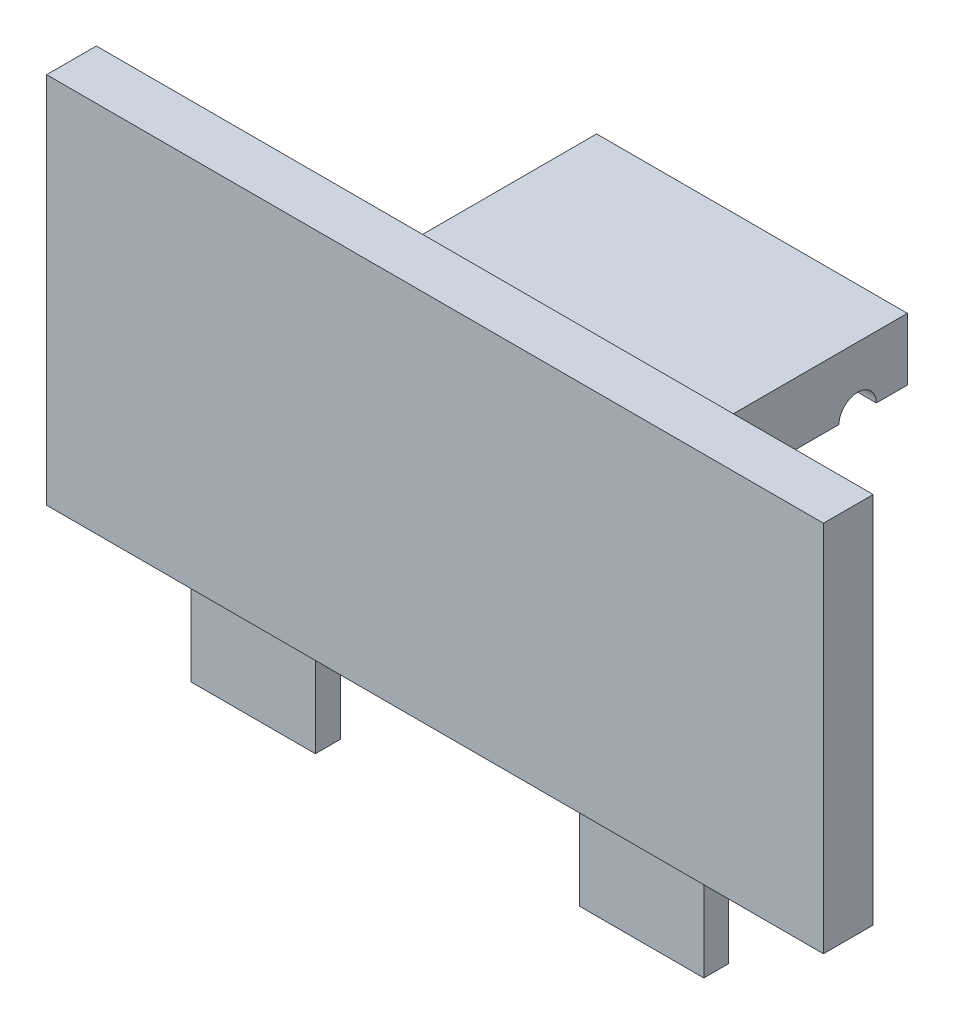
ISO-10303-21;
HEADER;
FILE_DESCRIPTION(('STEP AP214'),'2;1');
FILE_NAME('part.step','',(''),(''),'','','');
FILE_SCHEMA(('AUTOMOTIVE_DESIGN { 1 0 10303 214 1 1 1 1 }'));
ENDSEC;
DATA;
#1=APPLICATION_CONTEXT('core data for automotive mechanical design processes');
#2=APPLICATION_PROTOCOL_DEFINITION('international standard','automotive_design',2000,#1);
#3=PRODUCT_CONTEXT('',#1,'mechanical');
#4=PRODUCT('Part','Part','',(#3));
#5=PRODUCT_RELATED_PRODUCT_CATEGORY('part','',(#4));
#6=PRODUCT_DEFINITION_FORMATION('','',#4);
#7=PRODUCT_DEFINITION_CONTEXT('part definition',#1,'design');
#8=PRODUCT_DEFINITION('design','',#6,#7);
#9=PRODUCT_DEFINITION_SHAPE('','',#8);
#10=(LENGTH_UNIT() NAMED_UNIT(*) SI_UNIT(.MILLI.,.METRE.));
#11=(NAMED_UNIT(*) PLANE_ANGLE_UNIT() SI_UNIT($,.RADIAN.));
#12=(NAMED_UNIT(*) SI_UNIT($,.STERADIAN.) SOLID_ANGLE_UNIT());
#13=UNCERTAINTY_MEASURE_WITH_UNIT(LENGTH_MEASURE(1.E-05),#10,'distance_accuracy_value','');
#14=(GEOMETRIC_REPRESENTATION_CONTEXT(3) GLOBAL_UNCERTAINTY_ASSIGNED_CONTEXT((#13)) GLOBAL_UNIT_ASSIGNED_CONTEXT((#10,
#11,#12)) REPRESENTATION_CONTEXT('',''));
#15=CARTESIAN_POINT('',(0.,0.,0.));
#16=DIRECTION('',(0.,0.,1.));
#17=DIRECTION('',(1.,0.,0.));
#18=AXIS2_PLACEMENT_3D('',#15,#16,#17);
#19=CARTESIAN_POINT('',(87.5,35.,-51.));
#20=DIRECTION('',(0.,1.,0.));
#21=DIRECTION('',(0.,0.,1.));
#22=AXIS2_PLACEMENT_3D('',#19,#20,#21);
#23=PLANE('',#22);
#24=DIRECTION('',(0.,0.,1.));
#25=VECTOR('',#24,1.);
#26=CARTESIAN_POINT('',(87.5,35.,-51.));
#27=LINE('',#26,#25);
#28=CARTESIAN_POINT('',(87.5,35.,-51.));
#29=VERTEX_POINT('',#28);
#30=CARTESIAN_POINT('',(87.5,35.,-46.));
#31=VERTEX_POINT('',#30);
#32=EDGE_CURVE('E172',#29,#31,#27,.T.);
#33=ORIENTED_EDGE('',*,*,#32,.T.);
#34=DIRECTION('',(-1.,0.,0.));
#35=VECTOR('',#34,1.);
#36=CARTESIAN_POINT('',(37.5,35.,-46.));
#37=LINE('',#36,#35);
#38=CARTESIAN_POINT('',(37.5,35.,-46.));
#39=VERTEX_POINT('',#38);
#40=EDGE_CURVE('E11',#31,#39,#37,.T.);
#41=ORIENTED_EDGE('',*,*,#40,.T.);
#42=DIRECTION('',(0.,0.,1.));
#43=VECTOR('',#42,1.);
#44=CARTESIAN_POINT('',(37.5,35.,-51.));
#45=LINE('',#44,#43);
#46=CARTESIAN_POINT('',(37.5,35.,-51.));
#47=VERTEX_POINT('',#46);
#48=EDGE_CURVE('E184',#47,#39,#45,.T.);
#49=ORIENTED_EDGE('',*,*,#48,.F.);
#50=DIRECTION('',(-1.,0.,0.));
#51=VECTOR('',#50,1.);
#52=CARTESIAN_POINT('',(87.5,35.,-51.));
#53=LINE('',#52,#51);
#54=EDGE_CURVE('E178',#29,#47,#53,.T.);
#55=ORIENTED_EDGE('',*,*,#54,.F.);
#56=EDGE_LOOP('',(#33,#41,#49,#55));
#57=FACE_BOUND('',#56,.T.);
#58=ADVANCED_FACE('F37',(#57),#23,.F.);
#59=CARTESIAN_POINT('',(0.,0.,0.));
#60=DIRECTION('',(0.,-1.,0.));
#61=DIRECTION('',(0.,0.,-1.));
#62=AXIS2_PLACEMENT_3D('',#59,#60,#61);
#63=PLANE('',#62);
#64=DIRECTION('',(0.,0.,1.));
#65=VECTOR('',#64,1.);
#66=CARTESIAN_POINT('',(0.,0.,0.));
#67=LINE('',#66,#65);
#68=CARTESIAN_POINT('',(0.,0.,-8.));
#69=VERTEX_POINT('',#68);
#70=CARTESIAN_POINT('',(0.,0.,0.));
#71=VERTEX_POINT('',#70);
#72=EDGE_CURVE('E190',#69,#71,#67,.T.);
#73=ORIENTED_EDGE('',*,*,#72,.F.);
#74=DIRECTION('',(-1.,0.,0.));
#75=VECTOR('',#74,1.);
#76=CARTESIAN_POINT('',(0.,0.,-8.));
#77=LINE('',#76,#75);
#78=CARTESIAN_POINT('',(125.,0.,-8.));
#79=VERTEX_POINT('',#78);
#80=EDGE_CURVE('E195',#79,#69,#77,.T.);
#81=ORIENTED_EDGE('',*,*,#80,.F.);
#82=DIRECTION('',(0.,0.,-1.));
#83=VECTOR('',#82,1.);
#84=CARTESIAN_POINT('',(125.,0.,0.));
#85=LINE('',#84,#83);
#86=CARTESIAN_POINT('',(125.,0.,0.));
#87=VERTEX_POINT('',#86);
#88=EDGE_CURVE('E206',#87,#79,#85,.T.);
#89=ORIENTED_EDGE('',*,*,#88,.F.);
#90=DIRECTION('',(1.,0.,0.));
#91=VECTOR('',#90,1.);
#92=CARTESIAN_POINT('',(0.,0.,0.));
#93=LINE('',#92,#91);
#94=EDGE_CURVE('E204',#71,#87,#93,.T.);
#95=ORIENTED_EDGE('',*,*,#94,.F.);
#96=EDGE_LOOP('',(#73,#81,#89,#95));
#97=FACE_BOUND('',#96,.T.);
#98=DIRECTION('',(-1.,0.,0.));
#99=VECTOR('',#98,1.);
#100=CARTESIAN_POINT('',(21.25,0.,-2.));
#101=LINE('',#100,#99);
#102=CARTESIAN_POINT('',(41.25,0.,-2.));
#103=VERTEX_POINT('',#102);
#104=CARTESIAN_POINT('',(21.25,0.,-2.));
#105=VERTEX_POINT('',#104);
#106=EDGE_CURVE('E272',#103,#105,#101,.T.);
#107=ORIENTED_EDGE('',*,*,#106,.F.);
#108=DIRECTION('',(0.,0.,1.));
#109=VECTOR('',#108,1.);
#110=CARTESIAN_POINT('',(41.25,0.,-2.));
#111=LINE('',#110,#109);
#112=CARTESIAN_POINT('',(41.25,0.,-5.99999999999999));
#113=VERTEX_POINT('',#112);
#114=EDGE_CURVE('E258',#113,#103,#111,.T.);
#115=ORIENTED_EDGE('',*,*,#114,.F.);
#116=DIRECTION('',(1.,0.,0.));
#117=VECTOR('',#116,1.);
#118=CARTESIAN_POINT('',(21.25,0.,-5.99999999999999));
#119=LINE('',#118,#117);
#120=CARTESIAN_POINT('',(21.25,0.,-5.99999999999999));
#121=VERTEX_POINT('',#120);
#122=EDGE_CURVE('E263',#121,#113,#119,.T.);
#123=ORIENTED_EDGE('',*,*,#122,.F.);
#124=DIRECTION('',(0.,0.,-1.));
#125=VECTOR('',#124,1.);
#126=CARTESIAN_POINT('',(21.25,0.,-2.));
#127=LINE('',#126,#125);
#128=EDGE_CURVE('E274',#105,#121,#127,.T.);
#129=ORIENTED_EDGE('',*,*,#128,.F.);
#130=EDGE_LOOP('',(#107,#115,#123,#129));
#131=FACE_BOUND('',#130,.T.);
#132=DIRECTION('',(-1.,0.,0.));
#133=VECTOR('',#132,1.);
#134=CARTESIAN_POINT('',(83.75,0.,-2.));
#135=LINE('',#134,#133);
#136=CARTESIAN_POINT('',(103.75,0.,-2.));
#137=VERTEX_POINT('',#136);
#138=CARTESIAN_POINT('',(83.75,0.,-2.));
#139=VERTEX_POINT('',#138);
#140=EDGE_CURVE('E245',#137,#139,#135,.T.);
#141=ORIENTED_EDGE('',*,*,#140,.F.);
#142=DIRECTION('',(0.,0.,1.));
#143=VECTOR('',#142,1.);
#144=CARTESIAN_POINT('',(103.75,0.,-2.));
#145=LINE('',#144,#143);
#146=CARTESIAN_POINT('',(103.75,0.,-6.));
#147=VERTEX_POINT('',#146);
#148=EDGE_CURVE('E176',#147,#137,#145,.T.);
#149=ORIENTED_EDGE('',*,*,#148,.F.);
#150=DIRECTION('',(1.,0.,0.));
#151=VECTOR('',#150,1.);
#152=CARTESIAN_POINT('',(83.75,0.,-6.));
#153=LINE('',#152,#151);
#154=CARTESIAN_POINT('',(83.75,0.,-6.));
#155=VERTEX_POINT('',#154);
#156=EDGE_CURVE('E236',#155,#147,#153,.T.);
#157=ORIENTED_EDGE('',*,*,#156,.F.);
#158=DIRECTION('',(0.,0.,-1.));
#159=VECTOR('',#158,1.);
#160=CARTESIAN_POINT('',(83.75,0.,-2.));
#161=LINE('',#160,#159);
#162=EDGE_CURVE('E247',#139,#155,#161,.T.);
#163=ORIENTED_EDGE('',*,*,#162,.F.);
#164=EDGE_LOOP('',(#141,#149,#157,#163));
#165=FACE_BOUND('',#164,.T.);
#166=ADVANCED_FACE('F322',(#97,#131,#165),#63,.T.);
#167=CARTESIAN_POINT('',(0.,60.,-8.));
#168=DIRECTION('',(0.,0.,1.));
#169=DIRECTION('',(1.,0.,0.));
#170=AXIS2_PLACEMENT_3D('',#167,#168,#169);
#171=PLANE('',#170);
#172=ORIENTED_EDGE('',*,*,#80,.T.);
#173=DIRECTION('',(0.,-1.,0.));
#174=VECTOR('',#173,1.);
#175=CARTESIAN_POINT('',(0.,60.,-8.));
#176=LINE('',#175,#174);
#177=CARTESIAN_POINT('',(0.,60.,-8.));
#178=VERTEX_POINT('',#177);
#179=EDGE_CURVE('E201',#178,#69,#176,.T.);
#180=ORIENTED_EDGE('',*,*,#179,.F.);
#181=DIRECTION('',(-1.,0.,0.));
#182=VECTOR('',#181,1.);
#183=CARTESIAN_POINT('',(0.,60.,-8.));
#184=LINE('',#183,#182);
#185=CARTESIAN_POINT('',(125.,60.,-8.));
#186=VERTEX_POINT('',#185);
#187=EDGE_CURVE('E199',#186,#178,#184,.T.);
#188=ORIENTED_EDGE('',*,*,#187,.F.);
#189=DIRECTION('',(0.,-1.,0.));
#190=VECTOR('',#189,1.);
#191=CARTESIAN_POINT('',(125.,60.,-8.));
#192=LINE('',#191,#190);
#193=EDGE_CURVE('E211',#186,#79,#192,.T.);
#194=ORIENTED_EDGE('',*,*,#193,.T.);
#195=EDGE_LOOP('',(#172,#180,#188,#194));
#196=FACE_BOUND('',#195,.T.);
#197=DIRECTION('',(0.,1.,0.));
#198=VECTOR('',#197,1.);
#199=CARTESIAN_POINT('',(37.5,45.,-8.));
#200=LINE('',#199,#198);
#201=CARTESIAN_POINT('',(37.5,35.,-8.));
#202=VERTEX_POINT('',#201);
#203=CARTESIAN_POINT('',(37.5,45.,-8.));
#204=VERTEX_POINT('',#203);
#205=EDGE_CURVE('E287',#202,#204,#200,.T.);
#206=ORIENTED_EDGE('',*,*,#205,.F.);
#207=DIRECTION('',(-1.,0.,0.));
#208=VECTOR('',#207,1.);
#209=CARTESIAN_POINT('',(87.5,35.,-8.));
#210=LINE('',#209,#208);
#211=CARTESIAN_POINT('',(87.5,35.,-8.));
#212=VERTEX_POINT('',#211);
#213=EDGE_CURVE('E292',#212,#202,#210,.T.);
#214=ORIENTED_EDGE('',*,*,#213,.F.);
#215=DIRECTION('',(0.,-1.,0.));
#216=VECTOR('',#215,1.);
#217=CARTESIAN_POINT('',(87.5,45.,-8.));
#218=LINE('',#217,#216);
#219=CARTESIAN_POINT('',(87.5,45.,-8.));
#220=VERTEX_POINT('',#219);
#221=EDGE_CURVE('E301',#220,#212,#218,.T.);
#222=ORIENTED_EDGE('',*,*,#221,.F.);
#223=DIRECTION('',(1.,0.,0.));
#224=VECTOR('',#223,1.);
#225=CARTESIAN_POINT('',(87.5,45.,-8.));
#226=LINE('',#225,#224);
#227=EDGE_CURVE('E298',#204,#220,#226,.T.);
#228=ORIENTED_EDGE('',*,*,#227,.F.);
#229=EDGE_LOOP('',(#206,#214,#222,#228));
#230=FACE_BOUND('',#229,.T.);
#231=ADVANCED_FACE('F303',(#196,#230),#171,.F.);
#232=CARTESIAN_POINT('',(0.,60.,0.));
#233=DIRECTION('',(1.,0.,0.));
#234=DIRECTION('',(0.,0.,-1.));
#235=AXIS2_PLACEMENT_3D('',#232,#233,#234);
#236=PLANE('',#235);
#237=ORIENTED_EDGE('',*,*,#72,.T.);
#238=DIRECTION('',(0.,-1.,0.));
#239=VECTOR('',#238,1.);
#240=CARTESIAN_POINT('',(0.,60.,0.));
#241=LINE('',#240,#239);
#242=CARTESIAN_POINT('',(0.,60.,0.));
#243=VERTEX_POINT('',#242);
#244=EDGE_CURVE('E217',#243,#71,#241,.T.);
#245=ORIENTED_EDGE('',*,*,#244,.F.);
#246=DIRECTION('',(0.,0.,1.));
#247=VECTOR('',#246,1.);
#248=CARTESIAN_POINT('',(0.,60.,0.));
#249=LINE('',#248,#247);
#250=EDGE_CURVE('E191',#178,#243,#249,.T.);
#251=ORIENTED_EDGE('',*,*,#250,.F.);
#252=ORIENTED_EDGE('',*,*,#179,.T.);
#253=EDGE_LOOP('',(#237,#245,#251,#252));
#254=FACE_BOUND('',#253,.T.);
#255=ADVANCED_FACE('F39',(#254),#236,.F.);
#256=CARTESIAN_POINT('',(0.,60.,0.));
#257=DIRECTION('',(0.,0.,-1.));
#258=DIRECTION('',(-1.,0.,0.));
#259=AXIS2_PLACEMENT_3D('',#256,#257,#258);
#260=PLANE('',#259);
#261=ORIENTED_EDGE('',*,*,#94,.T.);
#262=DIRECTION('',(0.,-1.,0.));
#263=VECTOR('',#262,1.);
#264=CARTESIAN_POINT('',(125.,60.,0.));
#265=LINE('',#264,#263);
#266=CARTESIAN_POINT('',(125.,60.,0.));
#267=VERTEX_POINT('',#266);
#268=EDGE_CURVE('E214',#267,#87,#265,.T.);
#269=ORIENTED_EDGE('',*,*,#268,.F.);
#270=DIRECTION('',(1.,0.,0.));
#271=VECTOR('',#270,1.);
#272=CARTESIAN_POINT('',(0.,60.,0.));
#273=LINE('',#272,#271);
#274=EDGE_CURVE('E194',#243,#267,#273,.T.);
#275=ORIENTED_EDGE('',*,*,#274,.F.);
#276=ORIENTED_EDGE('',*,*,#244,.T.);
#277=EDGE_LOOP('',(#261,#269,#275,#276));
#278=FACE_BOUND('',#277,.T.);
#279=ADVANCED_FACE('F344',(#278),#260,.F.);
#280=CARTESIAN_POINT('',(125.,60.,0.));
#281=DIRECTION('',(-1.,0.,0.));
#282=DIRECTION('',(0.,0.,1.));
#283=AXIS2_PLACEMENT_3D('',#280,#281,#282);
#284=PLANE('',#283);
#285=ORIENTED_EDGE('',*,*,#88,.T.);
#286=ORIENTED_EDGE('',*,*,#193,.F.);
#287=DIRECTION('',(0.,0.,-1.));
#288=VECTOR('',#287,1.);
#289=CARTESIAN_POINT('',(125.,60.,0.));
#290=LINE('',#289,#288);
#291=EDGE_CURVE('E197',#267,#186,#290,.T.);
#292=ORIENTED_EDGE('',*,*,#291,.F.);
#293=ORIENTED_EDGE('',*,*,#268,.T.);
#294=EDGE_LOOP('',(#285,#286,#292,#293));
#295=FACE_BOUND('',#294,.T.);
#296=ADVANCED_FACE('F337',(#295),#284,.F.);
#297=CARTESIAN_POINT('',(0.,60.,0.));
#298=DIRECTION('',(0.,-1.,0.));
#299=DIRECTION('',(0.,0.,-1.));
#300=AXIS2_PLACEMENT_3D('',#297,#298,#299);
#301=PLANE('',#300);
#302=ORIENTED_EDGE('',*,*,#250,.T.);
#303=ORIENTED_EDGE('',*,*,#274,.T.);
#304=ORIENTED_EDGE('',*,*,#291,.T.);
#305=ORIENTED_EDGE('',*,*,#187,.T.);
#306=EDGE_LOOP('',(#302,#303,#304,#305));
#307=FACE_BOUND('',#306,.T.);
#308=ADVANCED_FACE('F335',(#307),#301,.F.);
#309=CARTESIAN_POINT('',(37.5,45.,-51.));
#310=DIRECTION('',(1.,0.,0.));
#311=DIRECTION('',(0.,1.,0.));
#312=AXIS2_PLACEMENT_3D('',#309,#310,#311);
#313=PLANE('',#312);
#314=ORIENTED_EDGE('',*,*,#48,.T.);
#315=CARTESIAN_POINT('',(37.5,35.,-43.));
#316=DIRECTION('',(-1.,0.,0.));
#317=DIRECTION('',(0.,0.,1.));
#318=AXIS2_PLACEMENT_3D('',#315,#316,#317);
#319=CIRCLE('',#318,3.);
#320=CARTESIAN_POINT('',(37.5,35.,-40.));
#321=VERTEX_POINT('',#320);
#322=EDGE_CURVE('E162',#321,#39,#319,.T.);
#323=ORIENTED_EDGE('',*,*,#322,.F.);
#324=EDGE_CURVE('E224',#321,#202,#45,.T.);
#325=ORIENTED_EDGE('',*,*,#324,.T.);
#326=ORIENTED_EDGE('',*,*,#205,.T.);
#327=DIRECTION('',(0.,0.,1.));
#328=VECTOR('',#327,1.);
#329=CARTESIAN_POINT('',(37.5,45.,-51.));
#330=LINE('',#329,#328);
#331=CARTESIAN_POINT('',(37.5,45.,-51.));
#332=VERTEX_POINT('',#331);
#333=EDGE_CURVE('E182',#332,#204,#330,.T.);
#334=ORIENTED_EDGE('',*,*,#333,.F.);
#335=DIRECTION('',(0.,1.,0.));
#336=VECTOR('',#335,1.);
#337=CARTESIAN_POINT('',(37.5,45.,-51.));
#338=LINE('',#337,#336);
#339=EDGE_CURVE('E288',#47,#332,#338,.T.);
#340=ORIENTED_EDGE('',*,*,#339,.F.);
#341=EDGE_LOOP('',(#314,#323,#325,#326,#334,#340));
#342=FACE_BOUND('',#341,.T.);
#343=ADVANCED_FACE('F226',(#342),#313,.F.);
#344=CARTESIAN_POINT('',(87.5,45.,-51.));
#345=DIRECTION('',(0.,-1.,0.));
#346=DIRECTION('',(0.,0.,-1.));
#347=AXIS2_PLACEMENT_3D('',#344,#345,#346);
#348=PLANE('',#347);
#349=ORIENTED_EDGE('',*,*,#227,.T.);
#350=DIRECTION('',(0.,0.,1.));
#351=VECTOR('',#350,1.);
#352=CARTESIAN_POINT('',(87.5,45.,-51.));
#353=LINE('',#352,#351);
#354=CARTESIAN_POINT('',(87.5,45.,-51.));
#355=VERTEX_POINT('',#354);
#356=EDGE_CURVE('E179',#355,#220,#353,.T.);
#357=ORIENTED_EDGE('',*,*,#356,.F.);
#358=DIRECTION('',(1.,0.,0.));
#359=VECTOR('',#358,1.);
#360=CARTESIAN_POINT('',(87.5,45.,-51.));
#361=LINE('',#360,#359);
#362=EDGE_CURVE('E291',#332,#355,#361,.T.);
#363=ORIENTED_EDGE('',*,*,#362,.F.);
#364=ORIENTED_EDGE('',*,*,#333,.T.);
#365=EDGE_LOOP('',(#349,#357,#363,#364));
#366=FACE_BOUND('',#365,.T.);
#367=ADVANCED_FACE('F306',(#366),#348,.F.);
#368=CARTESIAN_POINT('',(87.5,45.,-51.));
#369=DIRECTION('',(-1.,0.,0.));
#370=DIRECTION('',(0.,-1.,0.));
#371=AXIS2_PLACEMENT_3D('',#368,#369,#370);
#372=PLANE('',#371);
#373=CARTESIAN_POINT('',(87.5,35.,-40.));
#374=VERTEX_POINT('',#373);
#375=EDGE_CURVE('E175',#374,#212,#27,.T.);
#376=ORIENTED_EDGE('',*,*,#375,.F.);
#377=CARTESIAN_POINT('',(87.5,35.,-43.));
#378=DIRECTION('',(-1.,0.,0.));
#379=DIRECTION('',(0.,0.,1.));
#380=AXIS2_PLACEMENT_3D('',#377,#378,#379);
#381=CIRCLE('',#380,3.);
#382=EDGE_CURVE('E52',#374,#31,#381,.T.);
#383=ORIENTED_EDGE('',*,*,#382,.T.);
#384=ORIENTED_EDGE('',*,*,#32,.F.);
#385=DIRECTION('',(0.,-1.,0.));
#386=VECTOR('',#385,1.);
#387=CARTESIAN_POINT('',(87.5,45.,-51.));
#388=LINE('',#387,#386);
#389=EDGE_CURVE('E294',#355,#29,#388,.T.);
#390=ORIENTED_EDGE('',*,*,#389,.F.);
#391=ORIENTED_EDGE('',*,*,#356,.T.);
#392=ORIENTED_EDGE('',*,*,#221,.T.);
#393=EDGE_LOOP('',(#376,#383,#384,#390,#391,#392));
#394=FACE_BOUND('',#393,.T.);
#395=ADVANCED_FACE('F170',(#394),#372,.F.);
#396=ORIENTED_EDGE('',*,*,#324,.F.);
#397=DIRECTION('',(-1.,0.,0.));
#398=VECTOR('',#397,1.);
#399=CARTESIAN_POINT('',(37.5,35.,-40.));
#400=LINE('',#399,#398);
#401=EDGE_CURVE('E45',#321,#374,#400,.F.);
#402=ORIENTED_EDGE('',*,*,#401,.T.);
#403=ORIENTED_EDGE('',*,*,#375,.T.);
#404=ORIENTED_EDGE('',*,*,#213,.T.);
#405=EDGE_LOOP('',(#396,#402,#403,#404));
#406=FACE_BOUND('',#405,.T.);
#407=ADVANCED_FACE('F221',(#406),#23,.F.);
#408=CARTESIAN_POINT('',(0.,0.,-51.));
#409=DIRECTION('',(0.,0.,-1.));
#410=DIRECTION('',(-1.,0.,0.));
#411=AXIS2_PLACEMENT_3D('',#408,#409,#410);
#412=PLANE('',#411);
#413=ORIENTED_EDGE('',*,*,#339,.T.);
#414=ORIENTED_EDGE('',*,*,#362,.T.);
#415=ORIENTED_EDGE('',*,*,#389,.T.);
#416=ORIENTED_EDGE('',*,*,#54,.T.);
#417=EDGE_LOOP('',(#413,#414,#415,#416));
#418=FACE_BOUND('',#417,.T.);
#419=ADVANCED_FACE('F309',(#418),#412,.T.);
#420=CARTESIAN_POINT('',(41.25,-15.,-2.));
#421=DIRECTION('',(-1.,0.,0.));
#422=DIRECTION('',(0.,0.,1.));
#423=AXIS2_PLACEMENT_3D('',#420,#421,#422);
#424=PLANE('',#423);
#425=ORIENTED_EDGE('',*,*,#114,.T.);
#426=DIRECTION('',(0.,1.,0.));
#427=VECTOR('',#426,1.);
#428=CARTESIAN_POINT('',(41.25,-15.,-2.));
#429=LINE('',#428,#427);
#430=CARTESIAN_POINT('',(41.25,-15.,-2.));
#431=VERTEX_POINT('',#430);
#432=EDGE_CURVE('E285',#431,#103,#429,.T.);
#433=ORIENTED_EDGE('',*,*,#432,.F.);
#434=DIRECTION('',(0.,0.,1.));
#435=VECTOR('',#434,1.);
#436=CARTESIAN_POINT('',(41.25,-15.,-2.));
#437=LINE('',#436,#435);
#438=CARTESIAN_POINT('',(41.25,-15.,-5.99999999999999));
#439=VERTEX_POINT('',#438);
#440=EDGE_CURVE('E259',#439,#431,#437,.T.);
#441=ORIENTED_EDGE('',*,*,#440,.F.);
#442=DIRECTION('',(0.,1.,0.));
#443=VECTOR('',#442,1.);
#444=CARTESIAN_POINT('',(41.25,-15.,-5.99999999999999));
#445=LINE('',#444,#443);
#446=EDGE_CURVE('E269',#439,#113,#445,.T.);
#447=ORIENTED_EDGE('',*,*,#446,.T.);
#448=EDGE_LOOP('',(#425,#433,#441,#447));
#449=FACE_BOUND('',#448,.T.);
#450=ADVANCED_FACE('F311',(#449),#424,.F.);
#451=CARTESIAN_POINT('',(21.25,-15.,-2.));
#452=DIRECTION('',(0.,0.,-1.));
#453=DIRECTION('',(-1.,0.,0.));
#454=AXIS2_PLACEMENT_3D('',#451,#452,#453);
#455=PLANE('',#454);
#456=ORIENTED_EDGE('',*,*,#106,.T.);
#457=DIRECTION('',(0.,1.,0.));
#458=VECTOR('',#457,1.);
#459=CARTESIAN_POINT('',(21.25,-15.,-2.));
#460=LINE('',#459,#458);
#461=CARTESIAN_POINT('',(21.25,-15.,-2.));
#462=VERTEX_POINT('',#461);
#463=EDGE_CURVE('E282',#462,#105,#460,.T.);
#464=ORIENTED_EDGE('',*,*,#463,.F.);
#465=DIRECTION('',(-1.,0.,0.));
#466=VECTOR('',#465,1.);
#467=CARTESIAN_POINT('',(21.25,-15.,-2.));
#468=LINE('',#467,#466);
#469=EDGE_CURVE('E262',#431,#462,#468,.T.);
#470=ORIENTED_EDGE('',*,*,#469,.F.);
#471=ORIENTED_EDGE('',*,*,#432,.T.);
#472=EDGE_LOOP('',(#456,#464,#470,#471));
#473=FACE_BOUND('',#472,.T.);
#474=ADVANCED_FACE('F317',(#473),#455,.F.);
#475=CARTESIAN_POINT('',(21.25,-15.,-2.));
#476=DIRECTION('',(1.,0.,0.));
#477=DIRECTION('',(0.,0.,-1.));
#478=AXIS2_PLACEMENT_3D('',#475,#476,#477);
#479=PLANE('',#478);
#480=ORIENTED_EDGE('',*,*,#128,.T.);
#481=DIRECTION('',(0.,1.,0.));
#482=VECTOR('',#481,1.);
#483=CARTESIAN_POINT('',(21.25,-15.,-5.99999999999999));
#484=LINE('',#483,#482);
#485=CARTESIAN_POINT('',(21.25,-15.,-5.99999999999999));
#486=VERTEX_POINT('',#485);
#487=EDGE_CURVE('E280',#486,#121,#484,.T.);
#488=ORIENTED_EDGE('',*,*,#487,.F.);
#489=DIRECTION('',(0.,0.,-1.));
#490=VECTOR('',#489,1.);
#491=CARTESIAN_POINT('',(21.25,-15.,-2.));
#492=LINE('',#491,#490);
#493=EDGE_CURVE('E265',#462,#486,#492,.T.);
#494=ORIENTED_EDGE('',*,*,#493,.F.);
#495=ORIENTED_EDGE('',*,*,#463,.T.);
#496=EDGE_LOOP('',(#480,#488,#494,#495));
#497=FACE_BOUND('',#496,.T.);
#498=ADVANCED_FACE('F406',(#497),#479,.F.);
#499=CARTESIAN_POINT('',(21.25,-15.,-5.99999999999999));
#500=DIRECTION('',(0.,0.,1.));
#501=DIRECTION('',(1.,0.,0.));
#502=AXIS2_PLACEMENT_3D('',#499,#500,#501);
#503=PLANE('',#502);
#504=ORIENTED_EDGE('',*,*,#122,.T.);
#505=ORIENTED_EDGE('',*,*,#446,.F.);
#506=DIRECTION('',(1.,0.,0.));
#507=VECTOR('',#506,1.);
#508=CARTESIAN_POINT('',(21.25,-15.,-5.99999999999999));
#509=LINE('',#508,#507);
#510=EDGE_CURVE('E267',#486,#439,#509,.T.);
#511=ORIENTED_EDGE('',*,*,#510,.F.);
#512=ORIENTED_EDGE('',*,*,#487,.T.);
#513=EDGE_LOOP('',(#504,#505,#511,#512));
#514=FACE_BOUND('',#513,.T.);
#515=ADVANCED_FACE('F402',(#514),#503,.F.);
#516=CARTESIAN_POINT('',(0.,-15.,0.));
#517=DIRECTION('',(0.,-1.,0.));
#518=DIRECTION('',(0.,0.,-1.));
#519=AXIS2_PLACEMENT_3D('',#516,#517,#518);
#520=PLANE('',#519);
#521=ORIENTED_EDGE('',*,*,#440,.T.);
#522=ORIENTED_EDGE('',*,*,#469,.T.);
#523=ORIENTED_EDGE('',*,*,#493,.T.);
#524=ORIENTED_EDGE('',*,*,#510,.T.);
#525=EDGE_LOOP('',(#521,#522,#523,#524));
#526=FACE_BOUND('',#525,.T.);
#527=ADVANCED_FACE('F399',(#526),#520,.T.);
#528=CARTESIAN_POINT('',(103.75,-15.,-2.));
#529=DIRECTION('',(-1.,0.,0.));
#530=DIRECTION('',(0.,0.,1.));
#531=AXIS2_PLACEMENT_3D('',#528,#529,#530);
#532=PLANE('',#531);
#533=ORIENTED_EDGE('',*,*,#148,.T.);
#534=DIRECTION('',(0.,1.,0.));
#535=VECTOR('',#534,1.);
#536=CARTESIAN_POINT('',(103.75,-15.,-2.));
#537=LINE('',#536,#535);
#538=CARTESIAN_POINT('',(103.75,-15.,-2.));
#539=VERTEX_POINT('',#538);
#540=EDGE_CURVE('E256',#539,#137,#537,.T.);
#541=ORIENTED_EDGE('',*,*,#540,.F.);
#542=DIRECTION('',(0.,0.,1.));
#543=VECTOR('',#542,1.);
#544=CARTESIAN_POINT('',(103.75,-15.,-2.));
#545=LINE('',#544,#543);
#546=CARTESIAN_POINT('',(103.75,-15.,-6.));
#547=VERTEX_POINT('',#546);
#548=EDGE_CURVE('E232',#547,#539,#545,.T.);
#549=ORIENTED_EDGE('',*,*,#548,.F.);
#550=DIRECTION('',(0.,1.,0.));
#551=VECTOR('',#550,1.);
#552=CARTESIAN_POINT('',(103.75,-15.,-6.));
#553=LINE('',#552,#551);
#554=EDGE_CURVE('E242',#547,#147,#553,.T.);
#555=ORIENTED_EDGE('',*,*,#554,.T.);
#556=EDGE_LOOP('',(#533,#541,#549,#555));
#557=FACE_BOUND('',#556,.T.);
#558=ADVANCED_FACE('F383',(#557),#532,.F.);
#559=CARTESIAN_POINT('',(83.75,-15.,-2.));
#560=DIRECTION('',(0.,0.,-1.));
#561=DIRECTION('',(-1.,0.,0.));
#562=AXIS2_PLACEMENT_3D('',#559,#560,#561);
#563=PLANE('',#562);
#564=ORIENTED_EDGE('',*,*,#140,.T.);
#565=DIRECTION('',(0.,1.,0.));
#566=VECTOR('',#565,1.);
#567=CARTESIAN_POINT('',(83.75,-15.,-2.));
#568=LINE('',#567,#566);
#569=CARTESIAN_POINT('',(83.75,-15.,-2.));
#570=VERTEX_POINT('',#569);
#571=EDGE_CURVE('E253',#570,#139,#568,.T.);
#572=ORIENTED_EDGE('',*,*,#571,.F.);
#573=DIRECTION('',(-1.,0.,0.));
#574=VECTOR('',#573,1.);
#575=CARTESIAN_POINT('',(83.75,-15.,-2.));
#576=LINE('',#575,#574);
#577=EDGE_CURVE('E235',#539,#570,#576,.T.);
#578=ORIENTED_EDGE('',*,*,#577,.F.);
#579=ORIENTED_EDGE('',*,*,#540,.T.);
#580=EDGE_LOOP('',(#564,#572,#578,#579));
#581=FACE_BOUND('',#580,.T.);
#582=ADVANCED_FACE('F373',(#581),#563,.F.);
#583=CARTESIAN_POINT('',(83.75,-15.,-2.));
#584=DIRECTION('',(1.,0.,0.));
#585=DIRECTION('',(0.,0.,-1.));
#586=AXIS2_PLACEMENT_3D('',#583,#584,#585);
#587=PLANE('',#586);
#588=ORIENTED_EDGE('',*,*,#162,.T.);
#589=DIRECTION('',(0.,1.,0.));
#590=VECTOR('',#589,1.);
#591=CARTESIAN_POINT('',(83.75,-15.,-6.));
#592=LINE('',#591,#590);
#593=CARTESIAN_POINT('',(83.75,-15.,-6.));
#594=VERTEX_POINT('',#593);
#595=EDGE_CURVE('E60',#594,#155,#592,.T.);
#596=ORIENTED_EDGE('',*,*,#595,.F.);
#597=DIRECTION('',(0.,0.,-1.));
#598=VECTOR('',#597,1.);
#599=CARTESIAN_POINT('',(83.75,-15.,-2.));
#600=LINE('',#599,#598);
#601=EDGE_CURVE('E238',#570,#594,#600,.T.);
#602=ORIENTED_EDGE('',*,*,#601,.F.);
#603=ORIENTED_EDGE('',*,*,#571,.T.);
#604=EDGE_LOOP('',(#588,#596,#602,#603));
#605=FACE_BOUND('',#604,.T.);
#606=ADVANCED_FACE('F377',(#605),#587,.F.);
#607=CARTESIAN_POINT('',(83.75,-15.,-6.));
#608=DIRECTION('',(0.,0.,1.));
#609=DIRECTION('',(1.,0.,0.));
#610=AXIS2_PLACEMENT_3D('',#607,#608,#609);
#611=PLANE('',#610);
#612=ORIENTED_EDGE('',*,*,#156,.T.);
#613=ORIENTED_EDGE('',*,*,#554,.F.);
#614=DIRECTION('',(1.,0.,0.));
#615=VECTOR('',#614,1.);
#616=CARTESIAN_POINT('',(83.75,-15.,-6.));
#617=LINE('',#616,#615);
#618=EDGE_CURVE('E240',#594,#547,#617,.T.);
#619=ORIENTED_EDGE('',*,*,#618,.F.);
#620=ORIENTED_EDGE('',*,*,#595,.T.);
#621=EDGE_LOOP('',(#612,#613,#619,#620));
#622=FACE_BOUND('',#621,.T.);
#623=ADVANCED_FACE('F384',(#622),#611,.F.);
#624=CARTESIAN_POINT('',(0.,-15.,0.));
#625=DIRECTION('',(0.,-1.,0.));
#626=DIRECTION('',(0.,0.,-1.));
#627=AXIS2_PLACEMENT_3D('',#624,#625,#626);
#628=PLANE('',#627);
#629=ORIENTED_EDGE('',*,*,#548,.T.);
#630=ORIENTED_EDGE('',*,*,#577,.T.);
#631=ORIENTED_EDGE('',*,*,#601,.T.);
#632=ORIENTED_EDGE('',*,*,#618,.T.);
#633=EDGE_LOOP('',(#629,#630,#631,#632));
#634=FACE_BOUND('',#633,.T.);
#635=ADVANCED_FACE('F379',(#634),#628,.T.);
#636=CARTESIAN_POINT('',(37.5,35.,-43.));
#637=DIRECTION('',(-1.,0.,0.));
#638=DIRECTION('',(0.,0.,1.));
#639=AXIS2_PLACEMENT_3D('',#636,#637,#638);
#640=CYLINDRICAL_SURFACE('',#639,3.);
#641=ORIENTED_EDGE('',*,*,#382,.F.);
#642=ORIENTED_EDGE('',*,*,#401,.F.);
#643=ORIENTED_EDGE('',*,*,#322,.T.);
#644=ORIENTED_EDGE('',*,*,#40,.F.);
#645=EDGE_LOOP('',(#641,#642,#643,#644));
#646=FACE_BOUND('',#645,.T.);
#647=ADVANCED_FACE('F160',(#646),#640,.F.);
#648=CLOSED_SHELL('',(#58,#166,#231,#255,#279,#296,#308,#343,#367,#395,#407,#419,#450,#474,#498,
#515,#527,#558,#582,#606,#623,#635,#647));
#649=MANIFOLD_SOLID_BREP('B2',#648);
#650=ADVANCED_BREP_SHAPE_REPRESENTATION('',(#18,#649),#14);
#651=SHAPE_DEFINITION_REPRESENTATION(#9,#650);
ENDSEC;
END-ISO-10303-21;
